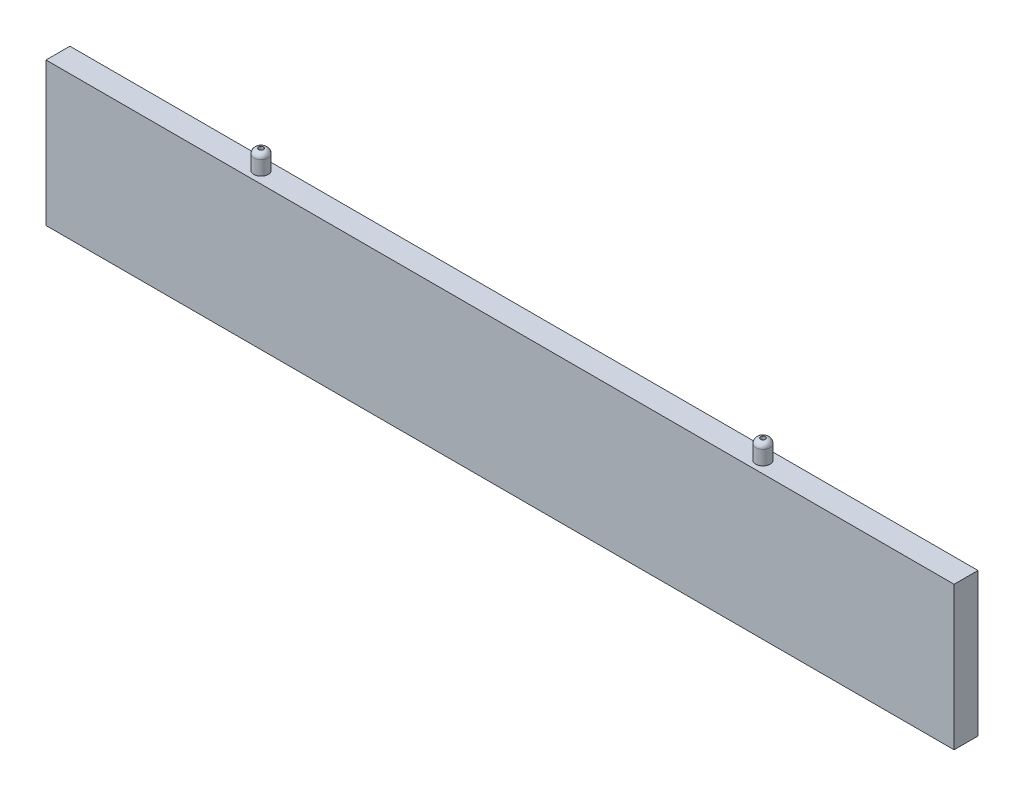
ISO-10303-21;
HEADER;
FILE_DESCRIPTION(('STEP AP214'),'2;1');
FILE_NAME('part.step','',(''),(''),'','','');
FILE_SCHEMA(('AUTOMOTIVE_DESIGN { 1 0 10303 214 1 1 1 1 }'));
ENDSEC;
DATA;
#1=APPLICATION_CONTEXT('core data for automotive mechanical design processes');
#2=APPLICATION_PROTOCOL_DEFINITION('international standard','automotive_design',2000,#1);
#3=PRODUCT_CONTEXT('',#1,'mechanical');
#4=PRODUCT('Part','Part','',(#3));
#5=PRODUCT_RELATED_PRODUCT_CATEGORY('part','',(#4));
#6=PRODUCT_DEFINITION_FORMATION('','',#4);
#7=PRODUCT_DEFINITION_CONTEXT('part definition',#1,'design');
#8=PRODUCT_DEFINITION('design','',#6,#7);
#9=PRODUCT_DEFINITION_SHAPE('','',#8);
#10=(LENGTH_UNIT() NAMED_UNIT(*) SI_UNIT(.MILLI.,.METRE.));
#11=(NAMED_UNIT(*) PLANE_ANGLE_UNIT() SI_UNIT($,.RADIAN.));
#12=(NAMED_UNIT(*) SI_UNIT($,.STERADIAN.) SOLID_ANGLE_UNIT());
#13=UNCERTAINTY_MEASURE_WITH_UNIT(LENGTH_MEASURE(1.E-05),#10,'distance_accuracy_value','');
#14=(GEOMETRIC_REPRESENTATION_CONTEXT(3) GLOBAL_UNCERTAINTY_ASSIGNED_CONTEXT((#13)) GLOBAL_UNIT_ASSIGNED_CONTEXT((#10,
#11,#12)) REPRESENTATION_CONTEXT('',''));
#15=CARTESIAN_POINT('',(0.,0.,0.));
#16=DIRECTION('',(0.,0.,1.));
#17=DIRECTION('',(1.,0.,0.));
#18=AXIS2_PLACEMENT_3D('',#15,#16,#17);
#19=CARTESIAN_POINT('',(95.,15.,5.));
#20=DIRECTION('',(-1.,0.,0.));
#21=DIRECTION('',(0.,-1.,0.));
#22=AXIS2_PLACEMENT_3D('',#19,#20,#21);
#23=PLANE('',#22);
#24=DIRECTION('',(0.,1.,0.));
#25=VECTOR('',#24,1.);
#26=CARTESIAN_POINT('',(95.,15.,0.));
#27=LINE('',#26,#25);
#28=CARTESIAN_POINT('',(95.,-15.,0.));
#29=VERTEX_POINT('',#28);
#30=CARTESIAN_POINT('',(95.,15.,0.));
#31=VERTEX_POINT('',#30);
#32=EDGE_CURVE('E101',#29,#31,#27,.T.);
#33=ORIENTED_EDGE('',*,*,#32,.T.);
#34=DIRECTION('',(0.,0.,-1.));
#35=VECTOR('',#34,1.);
#36=CARTESIAN_POINT('',(95.,15.,5.));
#37=LINE('',#36,#35);
#38=CARTESIAN_POINT('',(95.,15.,5.));
#39=VERTEX_POINT('',#38);
#40=EDGE_CURVE('E92',#39,#31,#37,.T.);
#41=ORIENTED_EDGE('',*,*,#40,.F.);
#42=DIRECTION('',(0.,1.,0.));
#43=VECTOR('',#42,1.);
#44=CARTESIAN_POINT('',(95.,15.,5.));
#45=LINE('',#44,#43);
#46=CARTESIAN_POINT('',(95.,-15.,5.));
#47=VERTEX_POINT('',#46);
#48=EDGE_CURVE('E86',#47,#39,#45,.T.);
#49=ORIENTED_EDGE('',*,*,#48,.F.);
#50=DIRECTION('',(0.,0.,-1.));
#51=VECTOR('',#50,1.);
#52=CARTESIAN_POINT('',(95.,-15.,5.));
#53=LINE('',#52,#51);
#54=EDGE_CURVE('E97',#47,#29,#53,.T.);
#55=ORIENTED_EDGE('',*,*,#54,.T.);
#56=EDGE_LOOP('',(#33,#41,#49,#55));
#57=FACE_BOUND('',#56,.T.);
#58=ADVANCED_FACE('F33',(#57),#23,.F.);
#59=CARTESIAN_POINT('',(-95.,15.,5.));
#60=DIRECTION('',(0.,-1.,0.));
#61=DIRECTION('',(0.,0.,-1.));
#62=AXIS2_PLACEMENT_3D('',#59,#60,#61);
#63=PLANE('',#62);
#64=CARTESIAN_POINT('',(52.5,15.,2.49999999999999));
#65=DIRECTION('',(0.,-1.,0.));
#66=DIRECTION('',(0.,0.,-1.));
#67=AXIS2_PLACEMENT_3D('',#64,#65,#66);
#68=CIRCLE('',#67,1.5);
#69=CARTESIAN_POINT('',(52.5,15.,0.999999999999983));
#70=VERTEX_POINT('',#69);
#71=EDGE_CURVE('E114',#70,#70,#68,.F.);
#72=ORIENTED_EDGE('',*,*,#71,.F.);
#73=EDGE_LOOP('',(#72));
#74=FACE_BOUND('',#73,.T.);
#75=CARTESIAN_POINT('',(-52.5,15.,2.5));
#76=DIRECTION('',(0.,-1.,0.));
#77=DIRECTION('',(0.,0.,-1.));
#78=AXIS2_PLACEMENT_3D('',#75,#76,#77);
#79=CIRCLE('',#78,1.5);
#80=CARTESIAN_POINT('',(-52.5,15.,0.999999999999996));
#81=VERTEX_POINT('',#80);
#82=EDGE_CURVE('E111',#81,#81,#79,.F.);
#83=ORIENTED_EDGE('',*,*,#82,.F.);
#84=EDGE_LOOP('',(#83));
#85=FACE_BOUND('',#84,.T.);
#86=DIRECTION('',(-1.,0.,0.));
#87=VECTOR('',#86,1.);
#88=CARTESIAN_POINT('',(-95.,15.,0.));
#89=LINE('',#88,#87);
#90=CARTESIAN_POINT('',(-95.,15.,0.));
#91=VERTEX_POINT('',#90);
#92=EDGE_CURVE('E91',#31,#91,#89,.T.);
#93=ORIENTED_EDGE('',*,*,#92,.T.);
#94=DIRECTION('',(0.,0.,-1.));
#95=VECTOR('',#94,1.);
#96=CARTESIAN_POINT('',(-95.,15.,5.));
#97=LINE('',#96,#95);
#98=CARTESIAN_POINT('',(-95.,15.,5.));
#99=VERTEX_POINT('',#98);
#100=EDGE_CURVE('E89',#99,#91,#97,.T.);
#101=ORIENTED_EDGE('',*,*,#100,.F.);
#102=DIRECTION('',(-1.,0.,0.));
#103=VECTOR('',#102,1.);
#104=CARTESIAN_POINT('',(-95.,15.,5.));
#105=LINE('',#104,#103);
#106=EDGE_CURVE('E81',#39,#99,#105,.T.);
#107=ORIENTED_EDGE('',*,*,#106,.F.);
#108=ORIENTED_EDGE('',*,*,#40,.T.);
#109=EDGE_LOOP('',(#93,#101,#107,#108));
#110=FACE_BOUND('',#109,.T.);
#111=ADVANCED_FACE('F90',(#74,#85,#110),#63,.F.);
#112=CARTESIAN_POINT('',(-95.,15.,5.));
#113=DIRECTION('',(1.,0.,0.));
#114=DIRECTION('',(0.,1.,0.));
#115=AXIS2_PLACEMENT_3D('',#112,#113,#114);
#116=PLANE('',#115);
#117=DIRECTION('',(0.,-1.,0.));
#118=VECTOR('',#117,1.);
#119=CARTESIAN_POINT('',(-95.,15.,0.));
#120=LINE('',#119,#118);
#121=CARTESIAN_POINT('',(-95.,-15.,0.));
#122=VERTEX_POINT('',#121);
#123=EDGE_CURVE('E67',#91,#122,#120,.T.);
#124=ORIENTED_EDGE('',*,*,#123,.T.);
#125=DIRECTION('',(0.,0.,-1.));
#126=VECTOR('',#125,1.);
#127=CARTESIAN_POINT('',(-95.,-15.,5.));
#128=LINE('',#127,#126);
#129=CARTESIAN_POINT('',(-95.,-15.,5.));
#130=VERTEX_POINT('',#129);
#131=EDGE_CURVE('E93',#130,#122,#128,.T.);
#132=ORIENTED_EDGE('',*,*,#131,.F.);
#133=DIRECTION('',(0.,-1.,0.));
#134=VECTOR('',#133,1.);
#135=CARTESIAN_POINT('',(-95.,15.,5.));
#136=LINE('',#135,#134);
#137=EDGE_CURVE('E84',#99,#130,#136,.T.);
#138=ORIENTED_EDGE('',*,*,#137,.F.);
#139=ORIENTED_EDGE('',*,*,#100,.T.);
#140=EDGE_LOOP('',(#124,#132,#138,#139));
#141=FACE_BOUND('',#140,.T.);
#142=ADVANCED_FACE('F95',(#141),#116,.F.);
#143=CARTESIAN_POINT('',(-95.,-15.,5.));
#144=DIRECTION('',(0.,1.,0.));
#145=DIRECTION('',(0.,0.,1.));
#146=AXIS2_PLACEMENT_3D('',#143,#144,#145);
#147=PLANE('',#146);
#148=DIRECTION('',(1.,0.,0.));
#149=VECTOR('',#148,1.);
#150=CARTESIAN_POINT('',(-95.,-15.,0.));
#151=LINE('',#150,#149);
#152=EDGE_CURVE('E73',#122,#29,#151,.T.);
#153=ORIENTED_EDGE('',*,*,#152,.T.);
#154=ORIENTED_EDGE('',*,*,#54,.F.);
#155=DIRECTION('',(1.,0.,0.));
#156=VECTOR('',#155,1.);
#157=CARTESIAN_POINT('',(-95.,-15.,5.));
#158=LINE('',#157,#156);
#159=EDGE_CURVE('E50',#130,#47,#158,.T.);
#160=ORIENTED_EDGE('',*,*,#159,.F.);
#161=ORIENTED_EDGE('',*,*,#131,.T.);
#162=EDGE_LOOP('',(#153,#154,#160,#161));
#163=FACE_BOUND('',#162,.T.);
#164=ADVANCED_FACE('F161',(#163),#147,.F.);
#165=CARTESIAN_POINT('',(0.,0.,5.));
#166=DIRECTION('',(0.,0.,1.));
#167=DIRECTION('',(1.,0.,0.));
#168=AXIS2_PLACEMENT_3D('',#165,#166,#167);
#169=PLANE('',#168);
#170=ORIENTED_EDGE('',*,*,#48,.T.);
#171=ORIENTED_EDGE('',*,*,#106,.T.);
#172=ORIENTED_EDGE('',*,*,#137,.T.);
#173=ORIENTED_EDGE('',*,*,#159,.T.);
#174=EDGE_LOOP('',(#170,#171,#172,#173));
#175=FACE_BOUND('',#174,.T.);
#176=ADVANCED_FACE('F82',(#175),#169,.T.);
#177=CARTESIAN_POINT('',(0.,0.,0.));
#178=DIRECTION('',(0.,0.,1.));
#179=DIRECTION('',(1.,0.,0.));
#180=AXIS2_PLACEMENT_3D('',#177,#178,#179);
#181=PLANE('',#180);
#182=ORIENTED_EDGE('',*,*,#32,.F.);
#183=ORIENTED_EDGE('',*,*,#152,.F.);
#184=ORIENTED_EDGE('',*,*,#123,.F.);
#185=ORIENTED_EDGE('',*,*,#92,.F.);
#186=EDGE_LOOP('',(#182,#183,#184,#185));
#187=FACE_BOUND('',#186,.T.);
#188=ADVANCED_FACE('F164',(#187),#181,.F.);
#189=CARTESIAN_POINT('',(-52.5,19.,2.5));
#190=DIRECTION('',(0.,-1.,0.));
#191=DIRECTION('',(0.,0.,-1.));
#192=AXIS2_PLACEMENT_3D('',#189,#190,#191);
#193=CYLINDRICAL_SURFACE('',#192,1.5);
#194=CARTESIAN_POINT('',(-52.5,18.,2.5));
#195=DIRECTION('',(0.,1.,0.));
#196=DIRECTION('',(0.,0.,1.));
#197=AXIS2_PLACEMENT_3D('',#194,#195,#196);
#198=CIRCLE('',#197,1.5);
#199=CARTESIAN_POINT('',(-52.5,18.,4.));
#200=VERTEX_POINT('',#199);
#201=EDGE_CURVE('E11',#200,#200,#198,.F.);
#202=ORIENTED_EDGE('',*,*,#201,.T.);
#203=EDGE_LOOP('',(#202));
#204=FACE_BOUND('',#203,.T.);
#205=ORIENTED_EDGE('',*,*,#82,.T.);
#206=EDGE_LOOP('',(#205));
#207=FACE_BOUND('',#206,.T.);
#208=ADVANCED_FACE('F167',(#204,#207),#193,.T.);
#209=CARTESIAN_POINT('',(-52.5,19.,2.5));
#210=DIRECTION('',(0.,-1.,0.));
#211=DIRECTION('',(0.,0.,-1.));
#212=AXIS2_PLACEMENT_3D('',#209,#210,#211);
#213=CYLINDRICAL_SURFACE('',#212,0.499999999999999);
#214=CARTESIAN_POINT('',(-52.5,19.,2.5));
#215=DIRECTION('',(0.,1.,0.));
#216=DIRECTION('',(0.,0.,1.));
#217=AXIS2_PLACEMENT_3D('',#214,#215,#216);
#218=CIRCLE('',#217,0.499999999999999);
#219=CARTESIAN_POINT('',(-52.5,19.,3.));
#220=VERTEX_POINT('',#219);
#221=EDGE_CURVE('E104',#220,#220,#218,.T.);
#222=ORIENTED_EDGE('',*,*,#221,.T.);
#223=EDGE_LOOP('',(#222));
#224=FACE_BOUND('',#223,.T.);
#225=CARTESIAN_POINT('',(-52.5,15.,2.5));
#226=DIRECTION('',(0.,1.,0.));
#227=DIRECTION('',(0.,0.,1.));
#228=AXIS2_PLACEMENT_3D('',#225,#226,#227);
#229=CIRCLE('',#228,0.499999999999999);
#230=CARTESIAN_POINT('',(-52.5,15.,3.));
#231=VERTEX_POINT('',#230);
#232=EDGE_CURVE('E130',#231,#231,#229,.T.);
#233=ORIENTED_EDGE('',*,*,#232,.F.);
#234=EDGE_LOOP('',(#233));
#235=FACE_BOUND('',#234,.T.);
#236=ADVANCED_FACE('F141',(#224,#235),#213,.F.);
#237=ORIENTED_EDGE('',*,*,#232,.T.);
#238=EDGE_LOOP('',(#237));
#239=FACE_BOUND('',#238,.T.);
#240=ADVANCED_FACE('F157',(#239),#63,.F.);
#241=CARTESIAN_POINT('',(52.5,19.,2.49999999999999));
#242=DIRECTION('',(0.,-1.,0.));
#243=DIRECTION('',(0.,0.,-1.));
#244=AXIS2_PLACEMENT_3D('',#241,#242,#243);
#245=CYLINDRICAL_SURFACE('',#244,1.5);
#246=CARTESIAN_POINT('',(52.5,18.,2.49999999999999));
#247=DIRECTION('',(0.,-1.,0.));
#248=DIRECTION('',(0.,0.,-1.));
#249=AXIS2_PLACEMENT_3D('',#246,#247,#248);
#250=CIRCLE('',#249,1.5);
#251=CARTESIAN_POINT('',(52.5,18.,0.999999999999983));
#252=VERTEX_POINT('',#251);
#253=EDGE_CURVE('E42',#252,#252,#250,.T.);
#254=ORIENTED_EDGE('',*,*,#253,.T.);
#255=EDGE_LOOP('',(#254));
#256=FACE_BOUND('',#255,.T.);
#257=ORIENTED_EDGE('',*,*,#71,.T.);
#258=EDGE_LOOP('',(#257));
#259=FACE_BOUND('',#258,.T.);
#260=ADVANCED_FACE('F119',(#256,#259),#245,.T.);
#261=CARTESIAN_POINT('',(52.5,19.,2.49999999999999));
#262=DIRECTION('',(0.,-1.,0.));
#263=DIRECTION('',(0.,0.,-1.));
#264=AXIS2_PLACEMENT_3D('',#261,#262,#263);
#265=CYLINDRICAL_SURFACE('',#264,0.499999999999999);
#266=CARTESIAN_POINT('',(52.5,19.,2.49999999999999));
#267=DIRECTION('',(0.,1.,0.));
#268=DIRECTION('',(0.,0.,-1.));
#269=AXIS2_PLACEMENT_3D('',#266,#267,#268);
#270=CIRCLE('',#269,0.499999999999999);
#271=CARTESIAN_POINT('',(52.5,19.,1.99999999999999));
#272=VERTEX_POINT('',#271);
#273=EDGE_CURVE('E128',#272,#272,#270,.T.);
#274=ORIENTED_EDGE('',*,*,#273,.T.);
#275=EDGE_LOOP('',(#274));
#276=FACE_BOUND('',#275,.T.);
#277=CARTESIAN_POINT('',(52.5,15.,2.49999999999999));
#278=DIRECTION('',(0.,1.,0.));
#279=DIRECTION('',(0.,0.,-1.));
#280=AXIS2_PLACEMENT_3D('',#277,#278,#279);
#281=CIRCLE('',#280,0.499999999999999);
#282=CARTESIAN_POINT('',(52.5,15.,1.99999999999999));
#283=VERTEX_POINT('',#282);
#284=EDGE_CURVE('E131',#283,#283,#281,.T.);
#285=ORIENTED_EDGE('',*,*,#284,.F.);
#286=EDGE_LOOP('',(#285));
#287=FACE_BOUND('',#286,.T.);
#288=ADVANCED_FACE('F178',(#276,#287),#265,.F.);
#289=ORIENTED_EDGE('',*,*,#284,.T.);
#290=EDGE_LOOP('',(#289));
#291=FACE_BOUND('',#290,.T.);
#292=ADVANCED_FACE('F125',(#291),#63,.F.);
#293=CARTESIAN_POINT('',(52.5,18.,2.49999999999999));
#294=DIRECTION('',(0.,-1.,0.));
#295=DIRECTION('',(0.,0.,-1.));
#296=AXIS2_PLACEMENT_3D('',#293,#294,#295);
#297=DEGENERATE_TOROIDAL_SURFACE('',#296,0.500000000000004,1.,.T.);
#298=ORIENTED_EDGE('',*,*,#253,.F.);
#299=EDGE_LOOP('',(#298));
#300=FACE_BOUND('',#299,.T.);
#301=ORIENTED_EDGE('',*,*,#273,.F.);
#302=EDGE_LOOP('',(#301));
#303=FACE_BOUND('',#302,.T.);
#304=ADVANCED_FACE('F122',(#300,#303),#297,.T.);
#305=CARTESIAN_POINT('',(-52.5,18.,2.5));
#306=DIRECTION('',(0.,1.,0.));
#307=DIRECTION('',(0.,0.,1.));
#308=AXIS2_PLACEMENT_3D('',#305,#306,#307);
#309=DEGENERATE_TOROIDAL_SURFACE('',#308,0.500000000000004,1.,.T.);
#310=ORIENTED_EDGE('',*,*,#201,.F.);
#311=EDGE_LOOP('',(#310));
#312=FACE_BOUND('',#311,.T.);
#313=ORIENTED_EDGE('',*,*,#221,.F.);
#314=EDGE_LOOP('',(#313));
#315=FACE_BOUND('',#314,.T.);
#316=ADVANCED_FACE('F35',(#312,#315),#309,.T.);
#317=CLOSED_SHELL('',(#58,#111,#142,#164,#176,#188,#208,#236,#240,#260,#288,#292,#304,#316));
#318=MANIFOLD_SOLID_BREP('B2',#317);
#319=ADVANCED_BREP_SHAPE_REPRESENTATION('',(#18,#318),#14);
#320=SHAPE_DEFINITION_REPRESENTATION(#9,#319);
ENDSEC;
END-ISO-10303-21;
